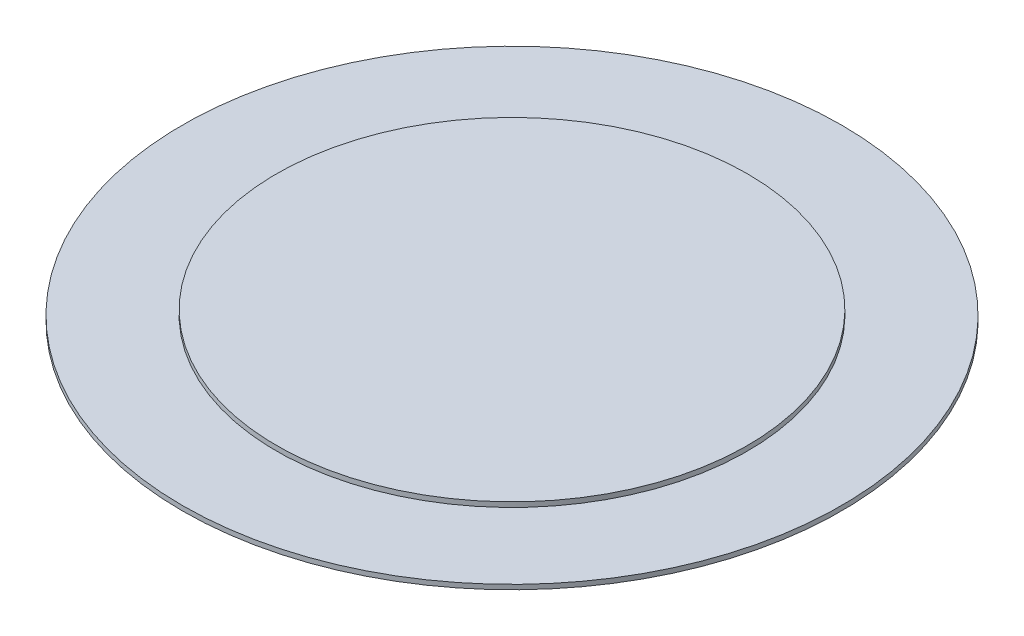
ISO-10303-21;
HEADER;
FILE_DESCRIPTION(('STEP AP214'),'2;1');
FILE_NAME('part.step','',(''),(''),'','','');
FILE_SCHEMA(('AUTOMOTIVE_DESIGN { 1 0 10303 214 1 1 1 1 }'));
ENDSEC;
DATA;
#1=APPLICATION_CONTEXT('core data for automotive mechanical design processes');
#2=APPLICATION_PROTOCOL_DEFINITION('international standard','automotive_design',2000,#1);
#3=PRODUCT_CONTEXT('',#1,'mechanical');
#4=PRODUCT('Part','Part','',(#3));
#5=PRODUCT_RELATED_PRODUCT_CATEGORY('part','',(#4));
#6=PRODUCT_DEFINITION_FORMATION('','',#4);
#7=PRODUCT_DEFINITION_CONTEXT('part definition',#1,'design');
#8=PRODUCT_DEFINITION('design','',#6,#7);
#9=PRODUCT_DEFINITION_SHAPE('','',#8);
#10=(LENGTH_UNIT() NAMED_UNIT(*) SI_UNIT(.MILLI.,.METRE.));
#11=(NAMED_UNIT(*) PLANE_ANGLE_UNIT() SI_UNIT($,.RADIAN.));
#12=(NAMED_UNIT(*) SI_UNIT($,.STERADIAN.) SOLID_ANGLE_UNIT());
#13=UNCERTAINTY_MEASURE_WITH_UNIT(LENGTH_MEASURE(1.E-05),#10,'distance_accuracy_value','');
#14=(GEOMETRIC_REPRESENTATION_CONTEXT(3) GLOBAL_UNCERTAINTY_ASSIGNED_CONTEXT((#13)) GLOBAL_UNIT_ASSIGNED_CONTEXT((#10,
#11,#12)) REPRESENTATION_CONTEXT('',''));
#15=CARTESIAN_POINT('',(0.,0.,0.));
#16=DIRECTION('',(0.,0.,1.));
#17=DIRECTION('',(1.,0.,0.));
#18=AXIS2_PLACEMENT_3D('',#15,#16,#17);
#19=CARTESIAN_POINT('',(0.,0.,0.));
#20=DIRECTION('',(0.,1.,0.));
#21=DIRECTION('',(0.,0.,1.));
#22=AXIS2_PLACEMENT_3D('',#19,#20,#21);
#23=PLANE('',#22);
#24=CARTESIAN_POINT('',(0.,0.,0.));
#25=DIRECTION('',(0.,-1.,0.));
#26=DIRECTION('',(0.,0.,-1.));
#27=AXIS2_PLACEMENT_3D('',#24,#25,#26);
#28=CIRCLE('',#27,17.5);
#29=CARTESIAN_POINT('',(0.,0.,-17.5));
#30=VERTEX_POINT('',#29);
#31=EDGE_CURVE('E10',#30,#30,#28,.T.);
#32=ORIENTED_EDGE('',*,*,#31,.T.);
#33=EDGE_LOOP('',(#32));
#34=FACE_BOUND('',#33,.T.);
#35=ADVANCED_FACE('F15',(#34),#23,.F.);
#36=CARTESIAN_POINT('',(0.,0.,0.));
#37=DIRECTION('',(0.,-1.,0.));
#38=DIRECTION('',(0.,0.,-1.));
#39=AXIS2_PLACEMENT_3D('',#36,#37,#38);
#40=CYLINDRICAL_SURFACE('',#39,17.5);
#41=ORIENTED_EDGE('',*,*,#31,.F.);
#42=EDGE_LOOP('',(#41));
#43=FACE_BOUND('',#42,.T.);
#44=CARTESIAN_POINT('',(0.,0.24999999999999,0.));
#45=DIRECTION('',(0.,-1.,0.));
#46=DIRECTION('',(0.,0.,-1.));
#47=AXIS2_PLACEMENT_3D('',#44,#45,#46);
#48=CIRCLE('',#47,17.5);
#49=CARTESIAN_POINT('',(0.,0.24999999999999,-17.5));
#50=VERTEX_POINT('',#49);
#51=EDGE_CURVE('E22',#50,#50,#48,.T.);
#52=ORIENTED_EDGE('',*,*,#51,.T.);
#53=EDGE_LOOP('',(#52));
#54=FACE_BOUND('',#53,.T.);
#55=ADVANCED_FACE('F57',(#43,#54),#40,.T.);
#56=CARTESIAN_POINT('',(-17.5,0.249999999999994,0.));
#57=DIRECTION('',(0.,-1.,0.));
#58=DIRECTION('',(0.,0.,-1.));
#59=AXIS2_PLACEMENT_3D('',#56,#57,#58);
#60=PLANE('',#59);
#61=ORIENTED_EDGE('',*,*,#51,.F.);
#62=EDGE_LOOP('',(#61));
#63=FACE_BOUND('',#62,.T.);
#64=CARTESIAN_POINT('',(0.,0.25,0.));
#65=DIRECTION('',(0.,-1.,0.));
#66=DIRECTION('',(0.,0.,-1.));
#67=AXIS2_PLACEMENT_3D('',#64,#65,#66);
#68=CIRCLE('',#67,12.5);
#69=CARTESIAN_POINT('',(0.,0.25,-12.5));
#70=VERTEX_POINT('',#69);
#71=EDGE_CURVE('E29',#70,#70,#68,.T.);
#72=ORIENTED_EDGE('',*,*,#71,.T.);
#73=EDGE_LOOP('',(#72));
#74=FACE_BOUND('',#73,.T.);
#75=ADVANCED_FACE('F53',(#63,#74),#60,.F.);
#76=CARTESIAN_POINT('',(0.,0.,0.));
#77=DIRECTION('',(0.,-1.,0.));
#78=DIRECTION('',(0.,0.,-1.));
#79=AXIS2_PLACEMENT_3D('',#76,#77,#78);
#80=CYLINDRICAL_SURFACE('',#79,12.5);
#81=ORIENTED_EDGE('',*,*,#71,.F.);
#82=EDGE_LOOP('',(#81));
#83=FACE_BOUND('',#82,.T.);
#84=CARTESIAN_POINT('',(0.,0.51,0.));
#85=DIRECTION('',(0.,-1.,0.));
#86=DIRECTION('',(0.,0.,-1.));
#87=AXIS2_PLACEMENT_3D('',#84,#85,#86);
#88=CIRCLE('',#87,12.5);
#89=CARTESIAN_POINT('',(0.,0.51,-12.5));
#90=VERTEX_POINT('',#89);
#91=EDGE_CURVE('E35',#90,#90,#88,.T.);
#92=ORIENTED_EDGE('',*,*,#91,.T.);
#93=EDGE_LOOP('',(#92));
#94=FACE_BOUND('',#93,.T.);
#95=ADVANCED_FACE('F44',(#83,#94),#80,.T.);
#96=CARTESIAN_POINT('',(-12.5,0.51,0.));
#97=DIRECTION('',(0.,-1.,0.));
#98=DIRECTION('',(0.,0.,-1.));
#99=AXIS2_PLACEMENT_3D('',#96,#97,#98);
#100=PLANE('',#99);
#101=ORIENTED_EDGE('',*,*,#91,.F.);
#102=EDGE_LOOP('',(#101));
#103=FACE_BOUND('',#102,.T.);
#104=ADVANCED_FACE('F46',(#103),#100,.F.);
#105=CLOSED_SHELL('',(#35,#55,#75,#95,#104));
#106=MANIFOLD_SOLID_BREP('B1',#105);
#107=ADVANCED_BREP_SHAPE_REPRESENTATION('',(#18,#106),#14);
#108=SHAPE_DEFINITION_REPRESENTATION(#9,#107);
ENDSEC;
END-ISO-10303-21;
